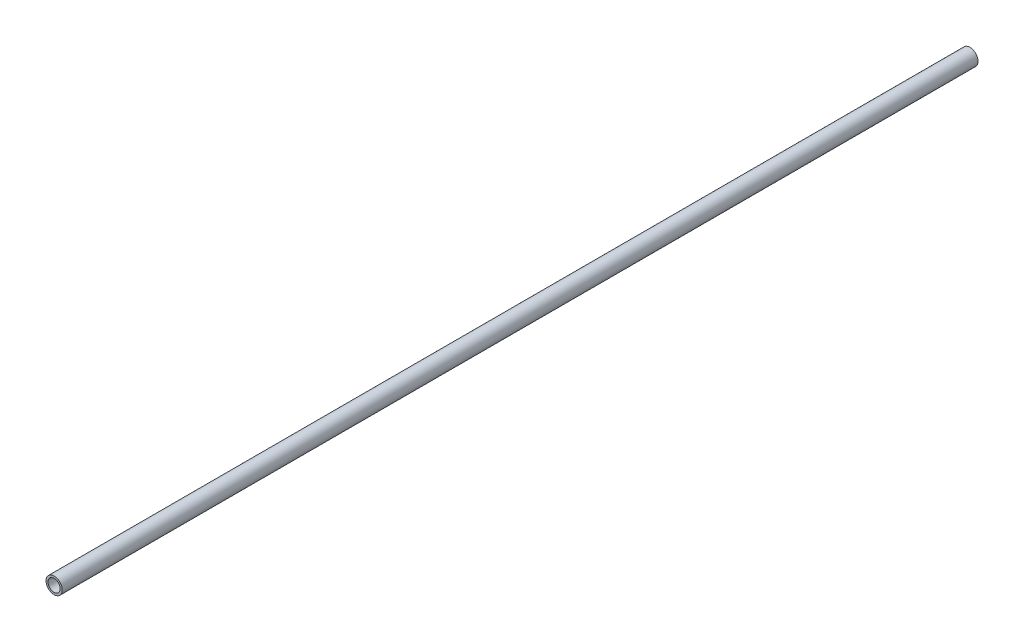
ISO-10303-21;
HEADER;
FILE_DESCRIPTION(('STEP AP214'),'2;1');
FILE_NAME('part.step','',(''),(''),'','','');
FILE_SCHEMA(('AUTOMOTIVE_DESIGN { 1 0 10303 214 1 1 1 1 }'));
ENDSEC;
DATA;
#1=APPLICATION_CONTEXT('core data for automotive mechanical design processes');
#2=APPLICATION_PROTOCOL_DEFINITION('international standard','automotive_design',2000,#1);
#3=PRODUCT_CONTEXT('',#1,'mechanical');
#4=PRODUCT('Part','Part','',(#3));
#5=PRODUCT_RELATED_PRODUCT_CATEGORY('part','',(#4));
#6=PRODUCT_DEFINITION_FORMATION('','',#4);
#7=PRODUCT_DEFINITION_CONTEXT('part definition',#1,'design');
#8=PRODUCT_DEFINITION('design','',#6,#7);
#9=PRODUCT_DEFINITION_SHAPE('','',#8);
#10=(LENGTH_UNIT() NAMED_UNIT(*) SI_UNIT(.MILLI.,.METRE.));
#11=(NAMED_UNIT(*) PLANE_ANGLE_UNIT() SI_UNIT($,.RADIAN.));
#12=(NAMED_UNIT(*) SI_UNIT($,.STERADIAN.) SOLID_ANGLE_UNIT());
#13=UNCERTAINTY_MEASURE_WITH_UNIT(LENGTH_MEASURE(1.E-05),#10,'distance_accuracy_value','');
#14=(GEOMETRIC_REPRESENTATION_CONTEXT(3) GLOBAL_UNCERTAINTY_ASSIGNED_CONTEXT((#13)) GLOBAL_UNIT_ASSIGNED_CONTEXT((#10,
#11,#12)) REPRESENTATION_CONTEXT('',''));
#15=CARTESIAN_POINT('',(0.,0.,0.));
#16=DIRECTION('',(0.,0.,1.));
#17=DIRECTION('',(1.,0.,0.));
#18=AXIS2_PLACEMENT_3D('',#15,#16,#17);
#19=CARTESIAN_POINT('',(0.,0.,226.06));
#20=DIRECTION('',(0.,0.,1.));
#21=DIRECTION('',(1.,0.,0.));
#22=AXIS2_PLACEMENT_3D('',#19,#20,#21);
#23=PLANE('',#22);
#24=CARTESIAN_POINT('',(0.,0.,226.06));
#25=DIRECTION('',(0.,0.,1.));
#26=DIRECTION('',(1.,0.,0.));
#27=AXIS2_PLACEMENT_3D('',#24,#25,#26);
#28=CIRCLE('',#27,2.);
#29=CARTESIAN_POINT('',(-2.,0.,226.06));
#30=VERTEX_POINT('',#29);
#31=EDGE_CURVE('E10',#30,#30,#28,.T.);
#32=ORIENTED_EDGE('',*,*,#31,.T.);
#33=EDGE_LOOP('',(#32));
#34=FACE_BOUND('',#33,.T.);
#35=CARTESIAN_POINT('',(0.,0.,226.06));
#36=DIRECTION('',(0.,0.,1.));
#37=DIRECTION('',(1.,0.,0.));
#38=AXIS2_PLACEMENT_3D('',#35,#36,#37);
#39=CIRCLE('',#38,1.5);
#40=CARTESIAN_POINT('',(-1.5,0.,226.06));
#41=VERTEX_POINT('',#40);
#42=EDGE_CURVE('E50',#41,#41,#39,.T.);
#43=ORIENTED_EDGE('',*,*,#42,.F.);
#44=EDGE_LOOP('',(#43));
#45=FACE_BOUND('',#44,.T.);
#46=ADVANCED_FACE('F37',(#34,#45),#23,.T.);
#47=CARTESIAN_POINT('',(0.,0.,0.));
#48=DIRECTION('',(0.,0.,1.));
#49=DIRECTION('',(1.,0.,0.));
#50=AXIS2_PLACEMENT_3D('',#47,#48,#49);
#51=PLANE('',#50);
#52=CARTESIAN_POINT('',(0.,0.,0.));
#53=DIRECTION('',(0.,0.,1.));
#54=DIRECTION('',(1.,0.,0.));
#55=AXIS2_PLACEMENT_3D('',#52,#53,#54);
#56=CIRCLE('',#55,2.);
#57=CARTESIAN_POINT('',(-2.,0.,0.));
#58=VERTEX_POINT('',#57);
#59=EDGE_CURVE('E41',#58,#58,#56,.T.);
#60=ORIENTED_EDGE('',*,*,#59,.F.);
#61=EDGE_LOOP('',(#60));
#62=FACE_BOUND('',#61,.T.);
#63=CARTESIAN_POINT('',(0.,0.,0.));
#64=DIRECTION('',(0.,0.,1.));
#65=DIRECTION('',(1.,0.,0.));
#66=AXIS2_PLACEMENT_3D('',#63,#64,#65);
#67=CIRCLE('',#66,1.5);
#68=CARTESIAN_POINT('',(-1.5,0.,0.));
#69=VERTEX_POINT('',#68);
#70=EDGE_CURVE('E52',#69,#69,#67,.T.);
#71=ORIENTED_EDGE('',*,*,#70,.T.);
#72=EDGE_LOOP('',(#71));
#73=FACE_BOUND('',#72,.T.);
#74=ADVANCED_FACE('F64',(#62,#73),#51,.F.);
#75=CARTESIAN_POINT('',(0.,0.,226.06));
#76=DIRECTION('',(0.,0.,-1.));
#77=DIRECTION('',(-1.,0.,0.));
#78=AXIS2_PLACEMENT_3D('',#75,#76,#77);
#79=CYLINDRICAL_SURFACE('',#78,2.);
#80=CARTESIAN_POINT('',(-2.,0.,226.06));
#81=CARTESIAN_POINT('',(-2.,0.,223.705208333333));
#82=CARTESIAN_POINT('',(-2.,0.,221.350416666667));
#83=CARTESIAN_POINT('',(-2.,0.,216.640833333333));
#84=CARTESIAN_POINT('',(-2.,0.,214.286041666667));
#85=CARTESIAN_POINT('',(-2.,0.,209.576458333333));
#86=CARTESIAN_POINT('',(-2.,0.,207.221666666667));
#87=CARTESIAN_POINT('',(-2.,0.,202.512083333333));
#88=CARTESIAN_POINT('',(-2.,0.,200.157291666667));
#89=CARTESIAN_POINT('',(-2.,0.,195.447708333333));
#90=CARTESIAN_POINT('',(-2.,0.,193.092916666667));
#91=CARTESIAN_POINT('',(-2.,0.,188.383333333333));
#92=CARTESIAN_POINT('',(-2.,0.,186.028541666667));
#93=CARTESIAN_POINT('',(-2.,0.,181.318958333333));
#94=CARTESIAN_POINT('',(-2.,0.,178.964166666667));
#95=CARTESIAN_POINT('',(-2.,0.,174.254583333333));
#96=CARTESIAN_POINT('',(-2.,0.,171.899791666667));
#97=CARTESIAN_POINT('',(-2.,0.,167.190208333333));
#98=CARTESIAN_POINT('',(-2.,0.,164.835416666667));
#99=CARTESIAN_POINT('',(-2.,0.,160.125833333333));
#100=CARTESIAN_POINT('',(-2.,0.,157.771041666667));
#101=CARTESIAN_POINT('',(-2.,0.,153.061458333333));
#102=CARTESIAN_POINT('',(-2.,0.,150.706666666667));
#103=CARTESIAN_POINT('',(-2.,0.,145.997083333333));
#104=CARTESIAN_POINT('',(-2.,0.,143.642291666667));
#105=CARTESIAN_POINT('',(-2.,0.,138.932708333333));
#106=CARTESIAN_POINT('',(-2.,0.,136.577916666667));
#107=CARTESIAN_POINT('',(-2.,0.,131.868333333333));
#108=CARTESIAN_POINT('',(-2.,0.,129.513541666667));
#109=CARTESIAN_POINT('',(-2.,0.,124.803958333333));
#110=CARTESIAN_POINT('',(-2.,0.,122.449166666667));
#111=CARTESIAN_POINT('',(-2.,0.,117.739583333333));
#112=CARTESIAN_POINT('',(-2.,0.,115.384791666667));
#113=CARTESIAN_POINT('',(-2.,0.,110.675208333333));
#114=CARTESIAN_POINT('',(-2.,0.,108.320416666667));
#115=CARTESIAN_POINT('',(-2.,0.,103.610833333333));
#116=CARTESIAN_POINT('',(-2.,0.,101.256041666667));
#117=CARTESIAN_POINT('',(-2.,0.,96.5464583333333));
#118=CARTESIAN_POINT('',(-2.,0.,94.1916666666667));
#119=CARTESIAN_POINT('',(-2.,0.,89.4820833333333));
#120=CARTESIAN_POINT('',(-2.,0.,87.1272916666667));
#121=CARTESIAN_POINT('',(-2.,0.,82.4177083333333));
#122=CARTESIAN_POINT('',(-2.,0.,80.0629166666667));
#123=CARTESIAN_POINT('',(-2.,0.,75.3533333333333));
#124=CARTESIAN_POINT('',(-2.,0.,72.9985416666667));
#125=CARTESIAN_POINT('',(-2.,0.,68.2889583333333));
#126=CARTESIAN_POINT('',(-2.,0.,65.9341666666667));
#127=CARTESIAN_POINT('',(-2.,0.,61.2245833333333));
#128=CARTESIAN_POINT('',(-2.,0.,58.8697916666667));
#129=CARTESIAN_POINT('',(-2.,0.,54.1602083333333));
#130=CARTESIAN_POINT('',(-2.,0.,51.8054166666667));
#131=CARTESIAN_POINT('',(-2.,0.,47.0958333333333));
#132=CARTESIAN_POINT('',(-2.,0.,44.7410416666667));
#133=CARTESIAN_POINT('',(-2.,0.,40.0314583333333));
#134=CARTESIAN_POINT('',(-2.,0.,37.6766666666667));
#135=CARTESIAN_POINT('',(-2.,0.,32.9670833333333));
#136=CARTESIAN_POINT('',(-2.,0.,30.6122916666667));
#137=CARTESIAN_POINT('',(-2.,0.,25.9027083333333));
#138=CARTESIAN_POINT('',(-2.,0.,23.5479166666667));
#139=CARTESIAN_POINT('',(-2.,0.,18.8383333333333));
#140=CARTESIAN_POINT('',(-2.,0.,16.4835416666667));
#141=CARTESIAN_POINT('',(-2.,0.,11.7739583333333));
#142=CARTESIAN_POINT('',(-2.,0.,9.41916666666667));
#143=CARTESIAN_POINT('',(-2.,0.,4.70958333333334));
#144=CARTESIAN_POINT('',(-2.,0.,2.35479166666667));
#145=CARTESIAN_POINT('',(-2.,0.,0.));
#146=B_SPLINE_CURVE_WITH_KNOTS('',3,(#80,#81,#82,#83,#84,#85,#86,#87,#88,#89,#90,#91,#92,#93,
#94,#95,#96,#97,#98,#99,#100,#101,#102,#103,#104,#105,#106,#107,#108,#109,#110,#111,#112,#113,
#114,#115,#116,#117,#118,#119,#120,#121,#122,#123,#124,#125,#126,#127,#128,#129,#130,#131,#132,
#133,#134,#135,#136,#137,#138,#139,#140,#141,#142,#143,#144,#145),.UNSPECIFIED.,.F.,.F.,(4,2,2,
2,2,2,2,2,2,2,2,2,2,2,2,2,2,2,2,2,2,2,2,2,2,2,2,2,2,2,2,2,4),(0.,7.06437499999998,14.12875,
21.193125,28.2575,35.321875,42.38625,49.450625,56.515,63.579375,70.64375,77.708125,84.7725,
91.836875,98.90125,105.965625,113.03,120.094375,127.15875,134.223125,141.2875,148.351875,
155.41625,162.480625,169.545,176.609375,183.67375,190.738125,197.8025,204.866875,211.93125,
218.995625,226.06),.UNSPECIFIED.);
#147=EDGE_CURVE('BSEAM39',#30,#58,#146,.T.);
#148=ORIENTED_EDGE('',*,*,#31,.F.);
#149=ORIENTED_EDGE('',*,*,#59,.T.);
#150=ORIENTED_EDGE('',*,*,#147,.T.);
#151=ORIENTED_EDGE('',*,*,#147,.F.);
#152=EDGE_LOOP('',(#148,#150,#149,#151));
#153=FACE_BOUND('',#152,.T.);
#154=ADVANCED_FACE('F39',(#153),#79,.T.);
#155=CARTESIAN_POINT('',(0.,0.,226.06));
#156=DIRECTION('',(0.,0.,-1.));
#157=DIRECTION('',(-1.,0.,0.));
#158=AXIS2_PLACEMENT_3D('',#155,#156,#157);
#159=CYLINDRICAL_SURFACE('',#158,1.5);
#160=CARTESIAN_POINT('',(-1.5,0.,226.06));
#161=CARTESIAN_POINT('',(-1.5,0.,223.705208333333));
#162=CARTESIAN_POINT('',(-1.5,0.,221.350416666667));
#163=CARTESIAN_POINT('',(-1.5,0.,216.640833333333));
#164=CARTESIAN_POINT('',(-1.5,0.,214.286041666667));
#165=CARTESIAN_POINT('',(-1.5,0.,209.576458333333));
#166=CARTESIAN_POINT('',(-1.5,0.,207.221666666667));
#167=CARTESIAN_POINT('',(-1.5,0.,202.512083333333));
#168=CARTESIAN_POINT('',(-1.5,0.,200.157291666667));
#169=CARTESIAN_POINT('',(-1.5,0.,195.447708333333));
#170=CARTESIAN_POINT('',(-1.5,0.,193.092916666667));
#171=CARTESIAN_POINT('',(-1.5,0.,188.383333333333));
#172=CARTESIAN_POINT('',(-1.5,0.,186.028541666667));
#173=CARTESIAN_POINT('',(-1.5,0.,181.318958333333));
#174=CARTESIAN_POINT('',(-1.5,0.,178.964166666667));
#175=CARTESIAN_POINT('',(-1.5,0.,174.254583333333));
#176=CARTESIAN_POINT('',(-1.5,0.,171.899791666667));
#177=CARTESIAN_POINT('',(-1.5,0.,167.190208333333));
#178=CARTESIAN_POINT('',(-1.5,0.,164.835416666667));
#179=CARTESIAN_POINT('',(-1.5,0.,160.125833333333));
#180=CARTESIAN_POINT('',(-1.5,0.,157.771041666667));
#181=CARTESIAN_POINT('',(-1.5,0.,153.061458333333));
#182=CARTESIAN_POINT('',(-1.5,0.,150.706666666667));
#183=CARTESIAN_POINT('',(-1.5,0.,145.997083333333));
#184=CARTESIAN_POINT('',(-1.5,0.,143.642291666667));
#185=CARTESIAN_POINT('',(-1.5,0.,138.932708333333));
#186=CARTESIAN_POINT('',(-1.5,0.,136.577916666667));
#187=CARTESIAN_POINT('',(-1.5,0.,131.868333333333));
#188=CARTESIAN_POINT('',(-1.5,0.,129.513541666667));
#189=CARTESIAN_POINT('',(-1.5,0.,124.803958333333));
#190=CARTESIAN_POINT('',(-1.5,0.,122.449166666667));
#191=CARTESIAN_POINT('',(-1.5,0.,117.739583333333));
#192=CARTESIAN_POINT('',(-1.5,0.,115.384791666667));
#193=CARTESIAN_POINT('',(-1.5,0.,110.675208333333));
#194=CARTESIAN_POINT('',(-1.5,0.,108.320416666667));
#195=CARTESIAN_POINT('',(-1.5,0.,103.610833333333));
#196=CARTESIAN_POINT('',(-1.5,0.,101.256041666667));
#197=CARTESIAN_POINT('',(-1.5,0.,96.5464583333333));
#198=CARTESIAN_POINT('',(-1.5,0.,94.1916666666667));
#199=CARTESIAN_POINT('',(-1.5,0.,89.4820833333333));
#200=CARTESIAN_POINT('',(-1.5,0.,87.1272916666667));
#201=CARTESIAN_POINT('',(-1.5,0.,82.4177083333333));
#202=CARTESIAN_POINT('',(-1.5,0.,80.0629166666667));
#203=CARTESIAN_POINT('',(-1.5,0.,75.3533333333333));
#204=CARTESIAN_POINT('',(-1.5,0.,72.9985416666667));
#205=CARTESIAN_POINT('',(-1.5,0.,68.2889583333333));
#206=CARTESIAN_POINT('',(-1.5,0.,65.9341666666667));
#207=CARTESIAN_POINT('',(-1.5,0.,61.2245833333333));
#208=CARTESIAN_POINT('',(-1.5,0.,58.8697916666667));
#209=CARTESIAN_POINT('',(-1.5,0.,54.1602083333333));
#210=CARTESIAN_POINT('',(-1.5,0.,51.8054166666667));
#211=CARTESIAN_POINT('',(-1.5,0.,47.0958333333333));
#212=CARTESIAN_POINT('',(-1.5,0.,44.7410416666667));
#213=CARTESIAN_POINT('',(-1.5,0.,40.0314583333333));
#214=CARTESIAN_POINT('',(-1.5,0.,37.6766666666667));
#215=CARTESIAN_POINT('',(-1.5,0.,32.9670833333333));
#216=CARTESIAN_POINT('',(-1.5,0.,30.6122916666667));
#217=CARTESIAN_POINT('',(-1.5,0.,25.9027083333333));
#218=CARTESIAN_POINT('',(-1.5,0.,23.5479166666667));
#219=CARTESIAN_POINT('',(-1.5,0.,18.8383333333333));
#220=CARTESIAN_POINT('',(-1.5,0.,16.4835416666667));
#221=CARTESIAN_POINT('',(-1.5,0.,11.7739583333333));
#222=CARTESIAN_POINT('',(-1.5,0.,9.41916666666667));
#223=CARTESIAN_POINT('',(-1.5,0.,4.70958333333334));
#224=CARTESIAN_POINT('',(-1.5,0.,2.35479166666667));
#225=CARTESIAN_POINT('',(-1.5,0.,0.));
#226=B_SPLINE_CURVE_WITH_KNOTS('',3,(#160,#161,#162,#163,#164,#165,#166,#167,#168,#169,#170,
#171,#172,#173,#174,#175,#176,#177,#178,#179,#180,#181,#182,#183,#184,#185,#186,#187,#188,#189,
#190,#191,#192,#193,#194,#195,#196,#197,#198,#199,#200,#201,#202,#203,#204,#205,#206,#207,#208,
#209,#210,#211,#212,#213,#214,#215,#216,#217,#218,#219,#220,#221,#222,#223,#224,#225),
.UNSPECIFIED.,.F.,.F.,(4,2,2,2,2,2,2,2,2,2,2,2,2,2,2,2,2,2,2,2,2,2,2,2,2,2,2,2,2,2,2,2,4),(0.,
7.06437499999998,14.12875,21.193125,28.2575,35.321875,42.38625,49.450625,56.515,63.579375,
70.64375,77.708125,84.7725,91.836875,98.90125,105.965625,113.03,120.094375,127.15875,134.223125,
141.2875,148.351875,155.41625,162.480625,169.545,176.609375,183.67375,190.738125,197.8025,
204.866875,211.93125,218.995625,226.06),.UNSPECIFIED.);
#227=EDGE_CURVE('BSEAM60',#41,#69,#226,.T.);
#228=ORIENTED_EDGE('',*,*,#42,.T.);
#229=ORIENTED_EDGE('',*,*,#70,.F.);
#230=ORIENTED_EDGE('',*,*,#227,.T.);
#231=ORIENTED_EDGE('',*,*,#227,.F.);
#232=EDGE_LOOP('',(#228,#230,#229,#231));
#233=FACE_BOUND('',#232,.T.);
#234=ADVANCED_FACE('F60',(#233),#159,.F.);
#235=CLOSED_SHELL('',(#46,#74,#154,#234));
#236=MANIFOLD_SOLID_BREP('B2',#235);
#237=ADVANCED_BREP_SHAPE_REPRESENTATION('',(#18,#236),#14);
#238=SHAPE_DEFINITION_REPRESENTATION(#9,#237);
ENDSEC;
END-ISO-10303-21;
